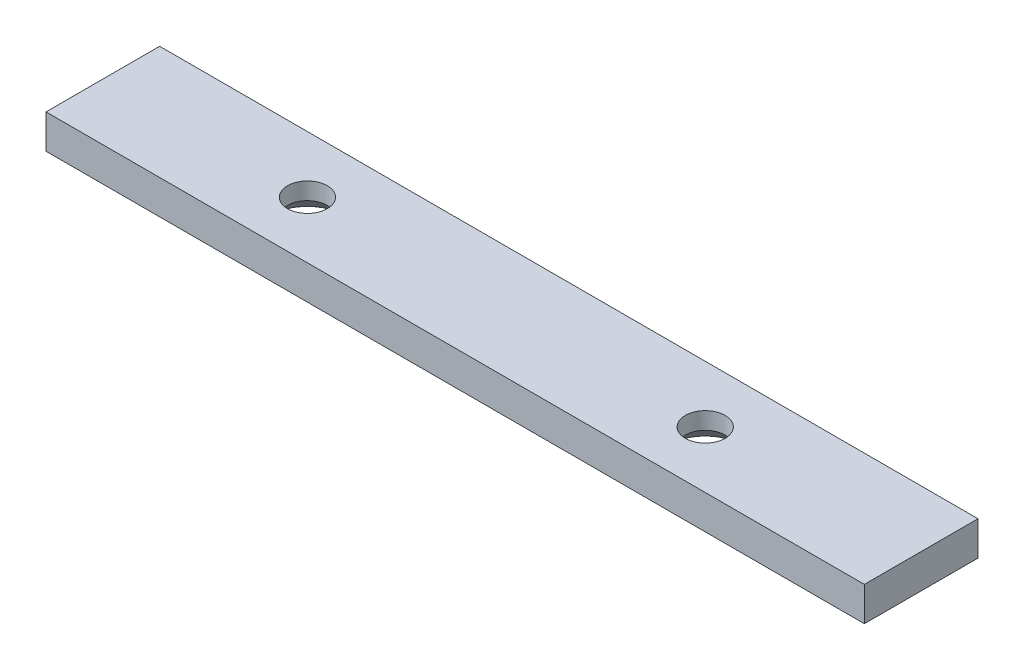
ISO-10303-21;
HEADER;
FILE_DESCRIPTION(('STEP AP214'),'2;1');
FILE_NAME('part.step','',(''),(''),'','','');
FILE_SCHEMA(('AUTOMOTIVE_DESIGN { 1 0 10303 214 1 1 1 1 }'));
ENDSEC;
DATA;
#1=APPLICATION_CONTEXT('core data for automotive mechanical design processes');
#2=APPLICATION_PROTOCOL_DEFINITION('international standard','automotive_design',2000,#1);
#3=PRODUCT_CONTEXT('',#1,'mechanical');
#4=PRODUCT('Part','Part','',(#3));
#5=PRODUCT_RELATED_PRODUCT_CATEGORY('part','',(#4));
#6=PRODUCT_DEFINITION_FORMATION('','',#4);
#7=PRODUCT_DEFINITION_CONTEXT('part definition',#1,'design');
#8=PRODUCT_DEFINITION('design','',#6,#7);
#9=PRODUCT_DEFINITION_SHAPE('','',#8);
#10=(LENGTH_UNIT() NAMED_UNIT(*) SI_UNIT(.MILLI.,.METRE.));
#11=(NAMED_UNIT(*) PLANE_ANGLE_UNIT() SI_UNIT($,.RADIAN.));
#12=(NAMED_UNIT(*) SI_UNIT($,.STERADIAN.) SOLID_ANGLE_UNIT());
#13=UNCERTAINTY_MEASURE_WITH_UNIT(LENGTH_MEASURE(1.E-05),#10,'distance_accuracy_value','');
#14=(GEOMETRIC_REPRESENTATION_CONTEXT(3) GLOBAL_UNCERTAINTY_ASSIGNED_CONTEXT((#13)) GLOBAL_UNIT_ASSIGNED_CONTEXT((#10,
#11,#12)) REPRESENTATION_CONTEXT('',''));
#15=CARTESIAN_POINT('',(0.,0.,0.));
#16=DIRECTION('',(0.,0.,1.));
#17=DIRECTION('',(1.,0.,0.));
#18=AXIS2_PLACEMENT_3D('',#15,#16,#17);
#19=CARTESIAN_POINT('',(0.,0.,0.));
#20=DIRECTION('',(0.,1.,0.));
#21=DIRECTION('',(0.,0.,1.));
#22=AXIS2_PLACEMENT_3D('',#19,#20,#21);
#23=PLANE('',#22);
#24=CARTESIAN_POINT('',(34.,0.,0.));
#25=DIRECTION('',(0.,-1.,0.));
#26=DIRECTION('',(0.,0.,-1.));
#27=AXIS2_PLACEMENT_3D('',#24,#25,#26);
#28=CIRCLE('',#27,6.5);
#29=CARTESIAN_POINT('',(34.,0.,-6.5));
#30=VERTEX_POINT('',#29);
#31=EDGE_CURVE('E119',#30,#30,#28,.T.);
#32=ORIENTED_EDGE('',*,*,#31,.F.);
#33=EDGE_LOOP('',(#32));
#34=FACE_BOUND('',#33,.T.);
#35=DIRECTION('',(0.,0.,-1.));
#36=VECTOR('',#35,1.);
#37=CARTESIAN_POINT('',(72.,0.,-10.));
#38=LINE('',#37,#36);
#39=CARTESIAN_POINT('',(72.,0.,10.));
#40=VERTEX_POINT('',#39);
#41=CARTESIAN_POINT('',(72.,0.,-10.));
#42=VERTEX_POINT('',#41);
#43=EDGE_CURVE('E100',#40,#42,#38,.T.);
#44=ORIENTED_EDGE('',*,*,#43,.F.);
#45=DIRECTION('',(1.,0.,0.));
#46=VECTOR('',#45,1.);
#47=CARTESIAN_POINT('',(-72.,0.,10.));
#48=LINE('',#47,#46);
#49=CARTESIAN_POINT('',(-72.,0.,10.));
#50=VERTEX_POINT('',#49);
#51=EDGE_CURVE('E76',#50,#40,#48,.T.);
#52=ORIENTED_EDGE('',*,*,#51,.F.);
#53=DIRECTION('',(0.,0.,1.));
#54=VECTOR('',#53,1.);
#55=CARTESIAN_POINT('',(-72.,0.,-10.));
#56=LINE('',#55,#54);
#57=CARTESIAN_POINT('',(-72.,0.,-10.));
#58=VERTEX_POINT('',#57);
#59=EDGE_CURVE('E70',#58,#50,#56,.T.);
#60=ORIENTED_EDGE('',*,*,#59,.F.);
#61=DIRECTION('',(-1.,0.,0.));
#62=VECTOR('',#61,1.);
#63=CARTESIAN_POINT('',(-72.,0.,-10.));
#64=LINE('',#63,#62);
#65=EDGE_CURVE('E92',#42,#58,#64,.T.);
#66=ORIENTED_EDGE('',*,*,#65,.F.);
#67=EDGE_LOOP('',(#44,#52,#60,#66));
#68=FACE_BOUND('',#67,.T.);
#69=CARTESIAN_POINT('',(-36.,0.,0.));
#70=DIRECTION('',(0.,-1.,0.));
#71=DIRECTION('',(0.,0.,-1.));
#72=AXIS2_PLACEMENT_3D('',#69,#70,#71);
#73=CIRCLE('',#72,6.5);
#74=CARTESIAN_POINT('',(-36.,0.,-6.5));
#75=VERTEX_POINT('',#74);
#76=EDGE_CURVE('E128',#75,#75,#73,.T.);
#77=ORIENTED_EDGE('',*,*,#76,.F.);
#78=EDGE_LOOP('',(#77));
#79=FACE_BOUND('',#78,.T.);
#80=ADVANCED_FACE('F36',(#34,#68,#79),#23,.F.);
#81=CARTESIAN_POINT('',(72.,6.,-10.));
#82=DIRECTION('',(-1.,0.,0.));
#83=DIRECTION('',(0.,0.,1.));
#84=AXIS2_PLACEMENT_3D('',#81,#82,#83);
#85=PLANE('',#84);
#86=ORIENTED_EDGE('',*,*,#43,.T.);
#87=DIRECTION('',(0.,-1.,0.));
#88=VECTOR('',#87,1.);
#89=CARTESIAN_POINT('',(72.,6.,-10.));
#90=LINE('',#89,#88);
#91=CARTESIAN_POINT('',(72.,6.,-10.));
#92=VERTEX_POINT('',#91);
#93=EDGE_CURVE('E11',#92,#42,#90,.T.);
#94=ORIENTED_EDGE('',*,*,#93,.F.);
#95=DIRECTION('',(0.,0.,-1.));
#96=VECTOR('',#95,1.);
#97=CARTESIAN_POINT('',(72.,6.,-10.));
#98=LINE('',#97,#96);
#99=CARTESIAN_POINT('',(72.,6.,10.));
#100=VERTEX_POINT('',#99);
#101=EDGE_CURVE('E88',#100,#92,#98,.T.);
#102=ORIENTED_EDGE('',*,*,#101,.F.);
#103=DIRECTION('',(0.,-1.,0.));
#104=VECTOR('',#103,1.);
#105=CARTESIAN_POINT('',(72.,6.,10.));
#106=LINE('',#105,#104);
#107=EDGE_CURVE('E96',#100,#40,#106,.T.);
#108=ORIENTED_EDGE('',*,*,#107,.T.);
#109=EDGE_LOOP('',(#86,#94,#102,#108));
#110=FACE_BOUND('',#109,.T.);
#111=ADVANCED_FACE('F38',(#110),#85,.F.);
#112=CARTESIAN_POINT('',(-72.,6.,-10.));
#113=DIRECTION('',(0.,0.,1.));
#114=DIRECTION('',(1.,0.,0.));
#115=AXIS2_PLACEMENT_3D('',#112,#113,#114);
#116=PLANE('',#115);
#117=ORIENTED_EDGE('',*,*,#65,.T.);
#118=DIRECTION('',(0.,-1.,0.));
#119=VECTOR('',#118,1.);
#120=CARTESIAN_POINT('',(-72.,6.,-10.));
#121=LINE('',#120,#119);
#122=CARTESIAN_POINT('',(-72.,6.,-10.));
#123=VERTEX_POINT('',#122);
#124=EDGE_CURVE('E45',#123,#58,#121,.T.);
#125=ORIENTED_EDGE('',*,*,#124,.F.);
#126=DIRECTION('',(-1.,0.,0.));
#127=VECTOR('',#126,1.);
#128=CARTESIAN_POINT('',(-72.,6.,-10.));
#129=LINE('',#128,#127);
#130=EDGE_CURVE('E83',#92,#123,#129,.T.);
#131=ORIENTED_EDGE('',*,*,#130,.F.);
#132=ORIENTED_EDGE('',*,*,#93,.T.);
#133=EDGE_LOOP('',(#117,#125,#131,#132));
#134=FACE_BOUND('',#133,.T.);
#135=ADVANCED_FACE('F91',(#134),#116,.F.);
#136=CARTESIAN_POINT('',(-72.,6.,-10.));
#137=DIRECTION('',(1.,0.,0.));
#138=DIRECTION('',(0.,0.,-1.));
#139=AXIS2_PLACEMENT_3D('',#136,#137,#138);
#140=PLANE('',#139);
#141=ORIENTED_EDGE('',*,*,#59,.T.);
#142=DIRECTION('',(0.,-1.,0.));
#143=VECTOR('',#142,1.);
#144=CARTESIAN_POINT('',(-72.,6.,10.));
#145=LINE('',#144,#143);
#146=CARTESIAN_POINT('',(-72.,6.,10.));
#147=VERTEX_POINT('',#146);
#148=EDGE_CURVE('E93',#147,#50,#145,.T.);
#149=ORIENTED_EDGE('',*,*,#148,.F.);
#150=DIRECTION('',(0.,0.,1.));
#151=VECTOR('',#150,1.);
#152=CARTESIAN_POINT('',(-72.,6.,-10.));
#153=LINE('',#152,#151);
#154=EDGE_CURVE('E86',#123,#147,#153,.T.);
#155=ORIENTED_EDGE('',*,*,#154,.F.);
#156=ORIENTED_EDGE('',*,*,#124,.T.);
#157=EDGE_LOOP('',(#141,#149,#155,#156));
#158=FACE_BOUND('',#157,.T.);
#159=ADVANCED_FACE('F94',(#158),#140,.F.);
#160=CARTESIAN_POINT('',(-72.,6.,10.));
#161=DIRECTION('',(0.,0.,-1.));
#162=DIRECTION('',(-1.,0.,0.));
#163=AXIS2_PLACEMENT_3D('',#160,#161,#162);
#164=PLANE('',#163);
#165=ORIENTED_EDGE('',*,*,#51,.T.);
#166=ORIENTED_EDGE('',*,*,#107,.F.);
#167=DIRECTION('',(1.,0.,0.));
#168=VECTOR('',#167,1.);
#169=CARTESIAN_POINT('',(-72.,6.,10.));
#170=LINE('',#169,#168);
#171=EDGE_CURVE('E53',#147,#100,#170,.T.);
#172=ORIENTED_EDGE('',*,*,#171,.F.);
#173=ORIENTED_EDGE('',*,*,#148,.T.);
#174=EDGE_LOOP('',(#165,#166,#172,#173));
#175=FACE_BOUND('',#174,.T.);
#176=ADVANCED_FACE('F108',(#175),#164,.F.);
#177=CARTESIAN_POINT('',(0.,6.,0.));
#178=DIRECTION('',(0.,1.,0.));
#179=DIRECTION('',(0.,0.,1.));
#180=AXIS2_PLACEMENT_3D('',#177,#178,#179);
#181=PLANE('',#180);
#182=CARTESIAN_POINT('',(-36.,6.,0.));
#183=DIRECTION('',(0.,1.,0.));
#184=DIRECTION('',(0.,0.,1.));
#185=AXIS2_PLACEMENT_3D('',#182,#183,#184);
#186=CIRCLE('',#185,3.5);
#187=CARTESIAN_POINT('',(-36.,6.,3.49999999999999));
#188=VERTEX_POINT('',#187);
#189=EDGE_CURVE('E122',#188,#188,#186,.T.);
#190=ORIENTED_EDGE('',*,*,#189,.F.);
#191=EDGE_LOOP('',(#190));
#192=FACE_BOUND('',#191,.T.);
#193=CARTESIAN_POINT('',(34.,6.,0.));
#194=DIRECTION('',(0.,1.,0.));
#195=DIRECTION('',(0.,0.,1.));
#196=AXIS2_PLACEMENT_3D('',#193,#194,#195);
#197=CIRCLE('',#196,3.5);
#198=CARTESIAN_POINT('',(34.,6.,3.49999999999999));
#199=VERTEX_POINT('',#198);
#200=EDGE_CURVE('E103',#199,#199,#197,.T.);
#201=ORIENTED_EDGE('',*,*,#200,.F.);
#202=EDGE_LOOP('',(#201));
#203=FACE_BOUND('',#202,.T.);
#204=ORIENTED_EDGE('',*,*,#101,.T.);
#205=ORIENTED_EDGE('',*,*,#130,.T.);
#206=ORIENTED_EDGE('',*,*,#154,.T.);
#207=ORIENTED_EDGE('',*,*,#171,.T.);
#208=EDGE_LOOP('',(#204,#205,#206,#207));
#209=FACE_BOUND('',#208,.T.);
#210=ADVANCED_FACE('F84',(#192,#203,#209),#181,.T.);
#211=CARTESIAN_POINT('',(34.,0.,0.));
#212=DIRECTION('',(0.,-1.,0.));
#213=DIRECTION('',(0.,0.,-1.));
#214=AXIS2_PLACEMENT_3D('',#211,#212,#213);
#215=CYLINDRICAL_SURFACE('',#214,3.5);
#216=CARTESIAN_POINT('',(34.,3.,0.));
#217=DIRECTION('',(0.,-1.,0.));
#218=DIRECTION('',(0.,0.,-1.));
#219=AXIS2_PLACEMENT_3D('',#216,#217,#218);
#220=CIRCLE('',#219,3.5);
#221=CARTESIAN_POINT('',(34.,3.,-3.5));
#222=VERTEX_POINT('',#221);
#223=EDGE_CURVE('E116',#222,#222,#220,.T.);
#224=ORIENTED_EDGE('',*,*,#223,.T.);
#225=EDGE_LOOP('',(#224));
#226=FACE_BOUND('',#225,.T.);
#227=ORIENTED_EDGE('',*,*,#200,.T.);
#228=EDGE_LOOP('',(#227));
#229=FACE_BOUND('',#228,.T.);
#230=ADVANCED_FACE('F166',(#226,#229),#215,.F.);
#231=CARTESIAN_POINT('',(34.,0.,0.));
#232=DIRECTION('',(0.,-1.,0.));
#233=DIRECTION('',(0.,0.,-1.));
#234=AXIS2_PLACEMENT_3D('',#231,#232,#233);
#235=CONICAL_SURFACE('',#234,6.5,0.785398163397448);
#236=ORIENTED_EDGE('',*,*,#223,.F.);
#237=EDGE_LOOP('',(#236));
#238=FACE_BOUND('',#237,.T.);
#239=ORIENTED_EDGE('',*,*,#31,.T.);
#240=EDGE_LOOP('',(#239));
#241=FACE_BOUND('',#240,.T.);
#242=ADVANCED_FACE('F173',(#238,#241),#235,.F.);
#243=CARTESIAN_POINT('',(-36.,0.,0.));
#244=DIRECTION('',(0.,-1.,0.));
#245=DIRECTION('',(0.,0.,-1.));
#246=AXIS2_PLACEMENT_3D('',#243,#244,#245);
#247=CYLINDRICAL_SURFACE('',#246,3.5);
#248=CARTESIAN_POINT('',(-36.,3.,0.));
#249=DIRECTION('',(0.,-1.,0.));
#250=DIRECTION('',(0.,0.,-1.));
#251=AXIS2_PLACEMENT_3D('',#248,#249,#250);
#252=CIRCLE('',#251,3.5);
#253=CARTESIAN_POINT('',(-36.,3.,-3.5));
#254=VERTEX_POINT('',#253);
#255=EDGE_CURVE('E125',#254,#254,#252,.T.);
#256=ORIENTED_EDGE('',*,*,#255,.T.);
#257=EDGE_LOOP('',(#256));
#258=FACE_BOUND('',#257,.T.);
#259=ORIENTED_EDGE('',*,*,#189,.T.);
#260=EDGE_LOOP('',(#259));
#261=FACE_BOUND('',#260,.T.);
#262=ADVANCED_FACE('F180',(#258,#261),#247,.F.);
#263=CARTESIAN_POINT('',(-36.,0.,0.));
#264=DIRECTION('',(0.,-1.,0.));
#265=DIRECTION('',(0.,0.,-1.));
#266=AXIS2_PLACEMENT_3D('',#263,#264,#265);
#267=CONICAL_SURFACE('',#266,6.5,0.785398163397448);
#268=ORIENTED_EDGE('',*,*,#255,.F.);
#269=EDGE_LOOP('',(#268));
#270=FACE_BOUND('',#269,.T.);
#271=ORIENTED_EDGE('',*,*,#76,.T.);
#272=EDGE_LOOP('',(#271));
#273=FACE_BOUND('',#272,.T.);
#274=ADVANCED_FACE('F132',(#270,#273),#267,.F.);
#275=CLOSED_SHELL('',(#80,#111,#135,#159,#176,#210,#230,#242,#262,#274));
#276=MANIFOLD_SOLID_BREP('B2',#275);
#277=ADVANCED_BREP_SHAPE_REPRESENTATION('',(#18,#276),#14);
#278=SHAPE_DEFINITION_REPRESENTATION(#9,#277);
ENDSEC;
END-ISO-10303-21;
